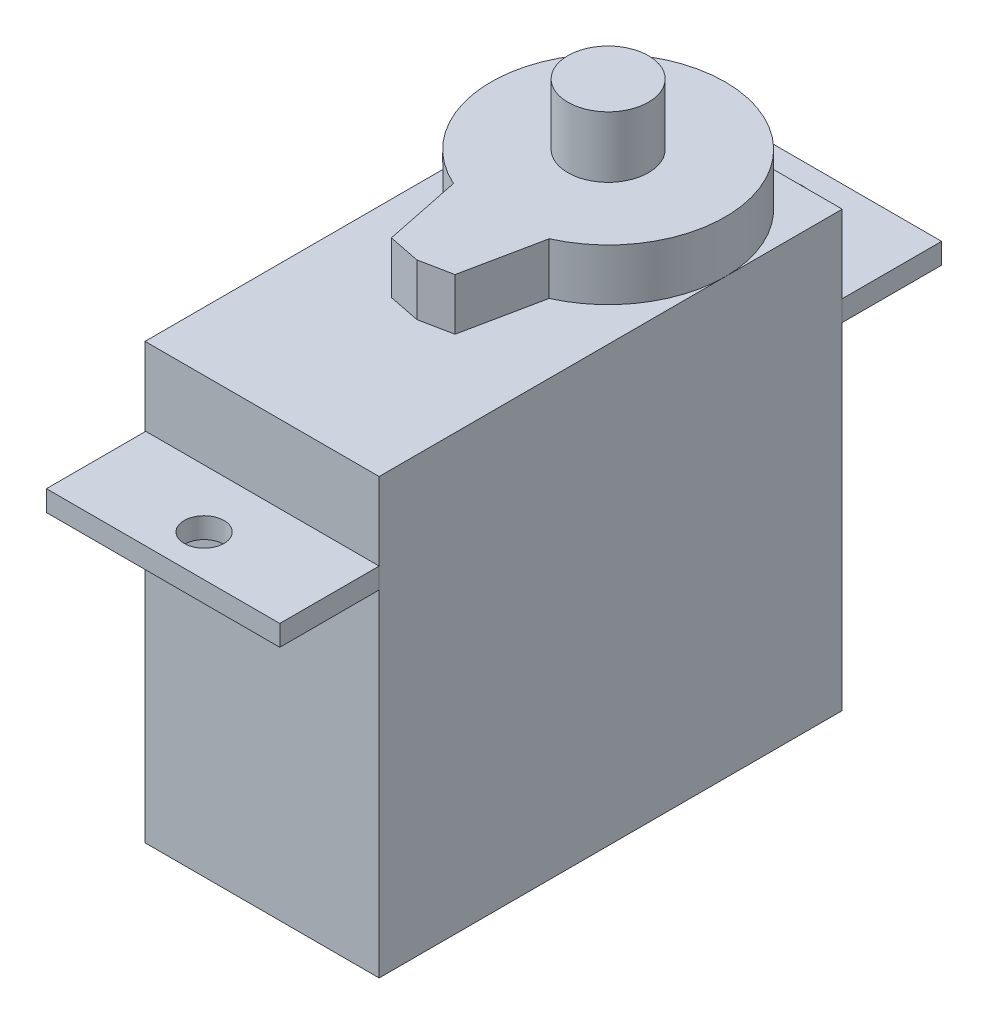
ISO-10303-21;
HEADER;
FILE_DESCRIPTION(('STEP AP214'),'2;1');
FILE_NAME('part.step','',(''),(''),'','','');
FILE_SCHEMA(('AUTOMOTIVE_DESIGN { 1 0 10303 214 1 1 1 1 }'));
ENDSEC;
DATA;
#1=APPLICATION_CONTEXT('core data for automotive mechanical design processes');
#2=APPLICATION_PROTOCOL_DEFINITION('international standard','automotive_design',2000,#1);
#3=PRODUCT_CONTEXT('',#1,'mechanical');
#4=PRODUCT('Part','Part','',(#3));
#5=PRODUCT_RELATED_PRODUCT_CATEGORY('part','',(#4));
#6=PRODUCT_DEFINITION_FORMATION('','',#4);
#7=PRODUCT_DEFINITION_CONTEXT('part definition',#1,'design');
#8=PRODUCT_DEFINITION('design','',#6,#7);
#9=PRODUCT_DEFINITION_SHAPE('','',#8);
#10=(LENGTH_UNIT() NAMED_UNIT(*) SI_UNIT(.MILLI.,.METRE.));
#11=(NAMED_UNIT(*) PLANE_ANGLE_UNIT() SI_UNIT($,.RADIAN.));
#12=(NAMED_UNIT(*) SI_UNIT($,.STERADIAN.) SOLID_ANGLE_UNIT());
#13=UNCERTAINTY_MEASURE_WITH_UNIT(LENGTH_MEASURE(1.E-05),#10,'distance_accuracy_value','');
#14=(GEOMETRIC_REPRESENTATION_CONTEXT(3) GLOBAL_UNCERTAINTY_ASSIGNED_CONTEXT((#13)) GLOBAL_UNIT_ASSIGNED_CONTEXT((#10,
#11,#12)) REPRESENTATION_CONTEXT('',''));
#15=CARTESIAN_POINT('',(0.,0.,0.));
#16=DIRECTION('',(0.,0.,1.));
#17=DIRECTION('',(1.,0.,0.));
#18=AXIS2_PLACEMENT_3D('',#15,#16,#17);
#19=CARTESIAN_POINT('',(-5.715,17.526,11.375));
#20=DIRECTION('',(0.,1.,0.));
#21=DIRECTION('',(0.,0.,1.));
#22=AXIS2_PLACEMENT_3D('',#19,#20,#21);
#23=PLANE('',#22);
#24=DIRECTION('',(-1.,0.,0.));
#25=VECTOR('',#24,1.);
#26=CARTESIAN_POINT('',(5.75,17.526,11.375));
#27=LINE('',#26,#25);
#28=CARTESIAN_POINT('',(5.75,17.526,11.375));
#29=VERTEX_POINT('',#28);
#30=CARTESIAN_POINT('',(-5.715,17.526,11.375));
#31=VERTEX_POINT('',#30);
#32=EDGE_CURVE('E190',#29,#31,#27,.T.);
#33=ORIENTED_EDGE('',*,*,#32,.T.);
#34=DIRECTION('',(0.,0.,1.));
#35=VECTOR('',#34,1.);
#36=CARTESIAN_POINT('',(-5.715,17.526,11.375));
#37=LINE('',#36,#35);
#38=CARTESIAN_POINT('',(-5.715,17.526,16.256));
#39=VERTEX_POINT('',#38);
#40=EDGE_CURVE('E185',#31,#39,#37,.T.);
#41=ORIENTED_EDGE('',*,*,#40,.T.);
#42=DIRECTION('',(1.,0.,0.));
#43=VECTOR('',#42,1.);
#44=CARTESIAN_POINT('',(5.75,17.526,16.256));
#45=LINE('',#44,#43);
#46=CARTESIAN_POINT('',(5.75,17.526,16.256));
#47=VERTEX_POINT('',#46);
#48=EDGE_CURVE('E188',#39,#47,#45,.T.);
#49=ORIENTED_EDGE('',*,*,#48,.T.);
#50=DIRECTION('',(0.,0.,-1.));
#51=VECTOR('',#50,1.);
#52=CARTESIAN_POINT('',(5.75,17.526,11.375));
#53=LINE('',#52,#51);
#54=EDGE_CURVE('E155',#47,#29,#53,.T.);
#55=ORIENTED_EDGE('',*,*,#54,.T.);
#56=EDGE_LOOP('',(#33,#41,#49,#55));
#57=FACE_BOUND('',#56,.T.);
#58=CARTESIAN_POINT('',(0.,17.526,14.224));
#59=DIRECTION('',(0.,1.,0.));
#60=DIRECTION('',(0.,0.,1.));
#61=AXIS2_PLACEMENT_3D('',#58,#59,#60);
#62=CIRCLE('',#61,0.9779);
#63=CARTESIAN_POINT('',(0.,17.526,15.2019));
#64=VERTEX_POINT('',#63);
#65=EDGE_CURVE('E205',#64,#64,#62,.T.);
#66=ORIENTED_EDGE('',*,*,#65,.F.);
#67=EDGE_LOOP('',(#66));
#68=FACE_BOUND('',#67,.T.);
#69=ADVANCED_FACE('F138',(#57,#68),#23,.T.);
#70=CARTESIAN_POINT('',(-5.715,16.51,11.375));
#71=DIRECTION('',(0.,1.,0.));
#72=DIRECTION('',(0.,0.,1.));
#73=AXIS2_PLACEMENT_3D('',#70,#71,#72);
#74=PLANE('',#73);
#75=DIRECTION('',(-1.,0.,0.));
#76=VECTOR('',#75,1.);
#77=CARTESIAN_POINT('',(5.75,16.51,11.375));
#78=LINE('',#77,#76);
#79=CARTESIAN_POINT('',(5.75,16.51,11.375));
#80=VERTEX_POINT('',#79);
#81=CARTESIAN_POINT('',(-5.715,16.51,11.375));
#82=VERTEX_POINT('',#81);
#83=EDGE_CURVE('E202',#80,#82,#78,.T.);
#84=ORIENTED_EDGE('',*,*,#83,.F.);
#85=DIRECTION('',(0.,0.,-1.));
#86=VECTOR('',#85,1.);
#87=CARTESIAN_POINT('',(5.75,16.51,11.375));
#88=LINE('',#87,#86);
#89=CARTESIAN_POINT('',(5.75,16.51,16.256));
#90=VERTEX_POINT('',#89);
#91=EDGE_CURVE('E178',#90,#80,#88,.T.);
#92=ORIENTED_EDGE('',*,*,#91,.F.);
#93=DIRECTION('',(1.,0.,0.));
#94=VECTOR('',#93,1.);
#95=CARTESIAN_POINT('',(5.75,16.51,16.256));
#96=LINE('',#95,#94);
#97=CARTESIAN_POINT('',(-5.715,16.51,16.256));
#98=VERTEX_POINT('',#97);
#99=EDGE_CURVE('E172',#98,#90,#96,.T.);
#100=ORIENTED_EDGE('',*,*,#99,.F.);
#101=DIRECTION('',(0.,0.,1.));
#102=VECTOR('',#101,1.);
#103=CARTESIAN_POINT('',(-5.715,16.51,11.375));
#104=LINE('',#103,#102);
#105=EDGE_CURVE('E194',#82,#98,#104,.T.);
#106=ORIENTED_EDGE('',*,*,#105,.F.);
#107=EDGE_LOOP('',(#84,#92,#100,#106));
#108=FACE_BOUND('',#107,.T.);
#109=CARTESIAN_POINT('',(0.,16.51,14.224));
#110=DIRECTION('',(0.,1.,0.));
#111=DIRECTION('',(0.,0.,1.));
#112=AXIS2_PLACEMENT_3D('',#109,#110,#111);
#113=CIRCLE('',#112,0.9779);
#114=CARTESIAN_POINT('',(0.,16.51,15.2019));
#115=VERTEX_POINT('',#114);
#116=EDGE_CURVE('E217',#115,#115,#113,.T.);
#117=ORIENTED_EDGE('',*,*,#116,.T.);
#118=EDGE_LOOP('',(#117));
#119=FACE_BOUND('',#118,.T.);
#120=ADVANCED_FACE('F213',(#108,#119),#74,.F.);
#121=CARTESIAN_POINT('',(5.75,17.526,11.375));
#122=DIRECTION('',(0.,0.,1.));
#123=DIRECTION('',(1.,0.,0.));
#124=AXIS2_PLACEMENT_3D('',#121,#122,#123);
#125=PLANE('',#124);
#126=ORIENTED_EDGE('',*,*,#83,.T.);
#127=DIRECTION('',(0.,-1.,0.));
#128=VECTOR('',#127,1.);
#129=CARTESIAN_POINT('',(-5.715,17.526,11.375));
#130=LINE('',#129,#128);
#131=EDGE_CURVE('E13',#31,#82,#130,.T.);
#132=ORIENTED_EDGE('',*,*,#131,.F.);
#133=ORIENTED_EDGE('',*,*,#32,.F.);
#134=DIRECTION('',(0.,-1.,0.));
#135=VECTOR('',#134,1.);
#136=CARTESIAN_POINT('',(5.75,17.526,11.375));
#137=LINE('',#136,#135);
#138=EDGE_CURVE('E198',#29,#80,#137,.T.);
#139=ORIENTED_EDGE('',*,*,#138,.T.);
#140=EDGE_LOOP('',(#126,#132,#133,#139));
#141=FACE_BOUND('',#140,.T.);
#142=ADVANCED_FACE('F140',(#141),#125,.F.);
#143=CARTESIAN_POINT('',(-5.715,17.526,11.375));
#144=DIRECTION('',(1.,0.,0.));
#145=DIRECTION('',(0.,0.,-1.));
#146=AXIS2_PLACEMENT_3D('',#143,#144,#145);
#147=PLANE('',#146);
#148=ORIENTED_EDGE('',*,*,#105,.T.);
#149=DIRECTION('',(0.,-1.,0.));
#150=VECTOR('',#149,1.);
#151=CARTESIAN_POINT('',(-5.715,17.526,16.256));
#152=LINE('',#151,#150);
#153=EDGE_CURVE('E147',#39,#98,#152,.T.);
#154=ORIENTED_EDGE('',*,*,#153,.F.);
#155=ORIENTED_EDGE('',*,*,#40,.F.);
#156=ORIENTED_EDGE('',*,*,#131,.T.);
#157=EDGE_LOOP('',(#148,#154,#155,#156));
#158=FACE_BOUND('',#157,.T.);
#159=ADVANCED_FACE('F193',(#158),#147,.F.);
#160=CARTESIAN_POINT('',(5.75,17.526,16.256));
#161=DIRECTION('',(0.,0.,-1.));
#162=DIRECTION('',(-1.,0.,0.));
#163=AXIS2_PLACEMENT_3D('',#160,#161,#162);
#164=PLANE('',#163);
#165=ORIENTED_EDGE('',*,*,#99,.T.);
#166=DIRECTION('',(0.,-1.,0.));
#167=VECTOR('',#166,1.);
#168=CARTESIAN_POINT('',(5.75,17.526,16.256));
#169=LINE('',#168,#167);
#170=EDGE_CURVE('E195',#47,#90,#169,.T.);
#171=ORIENTED_EDGE('',*,*,#170,.F.);
#172=ORIENTED_EDGE('',*,*,#48,.F.);
#173=ORIENTED_EDGE('',*,*,#153,.T.);
#174=EDGE_LOOP('',(#165,#171,#172,#173));
#175=FACE_BOUND('',#174,.T.);
#176=ADVANCED_FACE('F196',(#175),#164,.F.);
#177=CARTESIAN_POINT('',(5.75,17.526,11.375));
#178=DIRECTION('',(-1.,0.,0.));
#179=DIRECTION('',(0.,0.,1.));
#180=AXIS2_PLACEMENT_3D('',#177,#178,#179);
#181=PLANE('',#180);
#182=ORIENTED_EDGE('',*,*,#91,.T.);
#183=ORIENTED_EDGE('',*,*,#138,.F.);
#184=ORIENTED_EDGE('',*,*,#54,.F.);
#185=ORIENTED_EDGE('',*,*,#170,.T.);
#186=EDGE_LOOP('',(#182,#183,#184,#185));
#187=FACE_BOUND('',#186,.T.);
#188=ADVANCED_FACE('F210',(#187),#181,.F.);
#189=CARTESIAN_POINT('',(0.,17.526,14.224));
#190=DIRECTION('',(0.,-1.,0.));
#191=DIRECTION('',(0.,0.,-1.));
#192=AXIS2_PLACEMENT_3D('',#189,#190,#191);
#193=CYLINDRICAL_SURFACE('',#192,0.9779);
#194=ORIENTED_EDGE('',*,*,#65,.T.);
#195=EDGE_LOOP('',(#194));
#196=FACE_BOUND('',#195,.T.);
#197=ORIENTED_EDGE('',*,*,#116,.F.);
#198=EDGE_LOOP('',(#197));
#199=FACE_BOUND('',#198,.T.);
#200=ADVANCED_FACE('F223',(#196,#199),#193,.F.);
#201=CLOSED_SHELL('',(#69,#120,#142,#159,#176,#188,#200));
#202=MANIFOLD_SOLID_BREP('B2',#201);
#203=CARTESIAN_POINT('',(5.75,17.526,-16.256));
#204=DIRECTION('',(0.,1.,0.));
#205=DIRECTION('',(0.,0.,1.));
#206=AXIS2_PLACEMENT_3D('',#203,#204,#205);
#207=PLANE('',#206);
#208=DIRECTION('',(0.,0.,-1.));
#209=VECTOR('',#208,1.);
#210=CARTESIAN_POINT('',(5.75,17.526,-11.375));
#211=LINE('',#210,#209);
#212=CARTESIAN_POINT('',(5.75,17.526,-11.375));
#213=VERTEX_POINT('',#212);
#214=CARTESIAN_POINT('',(5.75,17.526,-16.256));
#215=VERTEX_POINT('',#214);
#216=EDGE_CURVE('E348',#213,#215,#211,.T.);
#217=ORIENTED_EDGE('',*,*,#216,.T.);
#218=DIRECTION('',(-1.,0.,0.));
#219=VECTOR('',#218,1.);
#220=CARTESIAN_POINT('',(5.75,17.526,-16.256));
#221=LINE('',#220,#219);
#222=CARTESIAN_POINT('',(-5.715,17.526,-16.256));
#223=VERTEX_POINT('',#222);
#224=EDGE_CURVE('E343',#215,#223,#221,.T.);
#225=ORIENTED_EDGE('',*,*,#224,.T.);
#226=DIRECTION('',(0.,0.,1.));
#227=VECTOR('',#226,1.);
#228=CARTESIAN_POINT('',(-5.715,17.526,-11.375));
#229=LINE('',#228,#227);
#230=CARTESIAN_POINT('',(-5.715,17.526,-11.375));
#231=VERTEX_POINT('',#230);
#232=EDGE_CURVE('E346',#223,#231,#229,.T.);
#233=ORIENTED_EDGE('',*,*,#232,.T.);
#234=DIRECTION('',(1.,0.,0.));
#235=VECTOR('',#234,1.);
#236=CARTESIAN_POINT('',(5.75,17.526,-11.375));
#237=LINE('',#236,#235);
#238=EDGE_CURVE('E313',#231,#213,#237,.T.);
#239=ORIENTED_EDGE('',*,*,#238,.T.);
#240=EDGE_LOOP('',(#217,#225,#233,#239));
#241=FACE_BOUND('',#240,.T.);
#242=CARTESIAN_POINT('',(0.,17.526,-14.224));
#243=DIRECTION('',(0.,1.,0.));
#244=DIRECTION('',(0.,0.,1.));
#245=AXIS2_PLACEMENT_3D('',#242,#243,#244);
#246=CIRCLE('',#245,0.9779);
#247=CARTESIAN_POINT('',(0.,17.526,-13.2461));
#248=VERTEX_POINT('',#247);
#249=EDGE_CURVE('E363',#248,#248,#246,.T.);
#250=ORIENTED_EDGE('',*,*,#249,.F.);
#251=EDGE_LOOP('',(#250));
#252=FACE_BOUND('',#251,.T.);
#253=ADVANCED_FACE('F296',(#241,#252),#207,.T.);
#254=CARTESIAN_POINT('',(5.75,16.51,-16.256));
#255=DIRECTION('',(0.,1.,0.));
#256=DIRECTION('',(0.,0.,1.));
#257=AXIS2_PLACEMENT_3D('',#254,#255,#256);
#258=PLANE('',#257);
#259=DIRECTION('',(0.,0.,-1.));
#260=VECTOR('',#259,1.);
#261=CARTESIAN_POINT('',(5.75,16.51,-11.375));
#262=LINE('',#261,#260);
#263=CARTESIAN_POINT('',(5.75,16.51,-11.375));
#264=VERTEX_POINT('',#263);
#265=CARTESIAN_POINT('',(5.75,16.51,-16.256));
#266=VERTEX_POINT('',#265);
#267=EDGE_CURVE('E360',#264,#266,#262,.T.);
#268=ORIENTED_EDGE('',*,*,#267,.F.);
#269=DIRECTION('',(1.,0.,0.));
#270=VECTOR('',#269,1.);
#271=CARTESIAN_POINT('',(5.75,16.51,-11.375));
#272=LINE('',#271,#270);
#273=CARTESIAN_POINT('',(-5.715,16.51,-11.375));
#274=VERTEX_POINT('',#273);
#275=EDGE_CURVE('E336',#274,#264,#272,.T.);
#276=ORIENTED_EDGE('',*,*,#275,.F.);
#277=DIRECTION('',(0.,0.,1.));
#278=VECTOR('',#277,1.);
#279=CARTESIAN_POINT('',(-5.715,16.51,-11.375));
#280=LINE('',#279,#278);
#281=CARTESIAN_POINT('',(-5.715,16.51,-16.256));
#282=VERTEX_POINT('',#281);
#283=EDGE_CURVE('E330',#282,#274,#280,.T.);
#284=ORIENTED_EDGE('',*,*,#283,.F.);
#285=DIRECTION('',(-1.,0.,0.));
#286=VECTOR('',#285,1.);
#287=CARTESIAN_POINT('',(5.75,16.51,-16.256));
#288=LINE('',#287,#286);
#289=EDGE_CURVE('E352',#266,#282,#288,.T.);
#290=ORIENTED_EDGE('',*,*,#289,.F.);
#291=EDGE_LOOP('',(#268,#276,#284,#290));
#292=FACE_BOUND('',#291,.T.);
#293=CARTESIAN_POINT('',(0.,16.51,-14.224));
#294=DIRECTION('',(0.,1.,0.));
#295=DIRECTION('',(0.,0.,1.));
#296=AXIS2_PLACEMENT_3D('',#293,#294,#295);
#297=CIRCLE('',#296,0.9779);
#298=CARTESIAN_POINT('',(0.,16.51,-13.2461));
#299=VERTEX_POINT('',#298);
#300=EDGE_CURVE('E375',#299,#299,#297,.T.);
#301=ORIENTED_EDGE('',*,*,#300,.T.);
#302=EDGE_LOOP('',(#301));
#303=FACE_BOUND('',#302,.T.);
#304=ADVANCED_FACE('F371',(#292,#303),#258,.F.);
#305=CARTESIAN_POINT('',(5.75,17.526,-11.375));
#306=DIRECTION('',(-1.,0.,0.));
#307=DIRECTION('',(0.,0.,1.));
#308=AXIS2_PLACEMENT_3D('',#305,#306,#307);
#309=PLANE('',#308);
#310=ORIENTED_EDGE('',*,*,#267,.T.);
#311=DIRECTION('',(0.,-1.,0.));
#312=VECTOR('',#311,1.);
#313=CARTESIAN_POINT('',(5.75,17.526,-16.256));
#314=LINE('',#313,#312);
#315=EDGE_CURVE('E136',#215,#266,#314,.T.);
#316=ORIENTED_EDGE('',*,*,#315,.F.);
#317=ORIENTED_EDGE('',*,*,#216,.F.);
#318=DIRECTION('',(0.,-1.,0.));
#319=VECTOR('',#318,1.);
#320=CARTESIAN_POINT('',(5.75,17.526,-11.375));
#321=LINE('',#320,#319);
#322=EDGE_CURVE('E356',#213,#264,#321,.T.);
#323=ORIENTED_EDGE('',*,*,#322,.T.);
#324=EDGE_LOOP('',(#310,#316,#317,#323));
#325=FACE_BOUND('',#324,.T.);
#326=ADVANCED_FACE('F298',(#325),#309,.F.);
#327=CARTESIAN_POINT('',(5.75,17.526,-16.256));
#328=DIRECTION('',(0.,0.,1.));
#329=DIRECTION('',(1.,0.,0.));
#330=AXIS2_PLACEMENT_3D('',#327,#328,#329);
#331=PLANE('',#330);
#332=ORIENTED_EDGE('',*,*,#289,.T.);
#333=DIRECTION('',(0.,-1.,0.));
#334=VECTOR('',#333,1.);
#335=CARTESIAN_POINT('',(-5.715,17.526,-16.256));
#336=LINE('',#335,#334);
#337=EDGE_CURVE('E305',#223,#282,#336,.T.);
#338=ORIENTED_EDGE('',*,*,#337,.F.);
#339=ORIENTED_EDGE('',*,*,#224,.F.);
#340=ORIENTED_EDGE('',*,*,#315,.T.);
#341=EDGE_LOOP('',(#332,#338,#339,#340));
#342=FACE_BOUND('',#341,.T.);
#343=ADVANCED_FACE('F351',(#342),#331,.F.);
#344=CARTESIAN_POINT('',(-5.715,17.526,-11.375));
#345=DIRECTION('',(1.,0.,0.));
#346=DIRECTION('',(0.,0.,-1.));
#347=AXIS2_PLACEMENT_3D('',#344,#345,#346);
#348=PLANE('',#347);
#349=ORIENTED_EDGE('',*,*,#283,.T.);
#350=DIRECTION('',(0.,-1.,0.));
#351=VECTOR('',#350,1.);
#352=CARTESIAN_POINT('',(-5.715,17.526,-11.375));
#353=LINE('',#352,#351);
#354=EDGE_CURVE('E353',#231,#274,#353,.T.);
#355=ORIENTED_EDGE('',*,*,#354,.F.);
#356=ORIENTED_EDGE('',*,*,#232,.F.);
#357=ORIENTED_EDGE('',*,*,#337,.T.);
#358=EDGE_LOOP('',(#349,#355,#356,#357));
#359=FACE_BOUND('',#358,.T.);
#360=ADVANCED_FACE('F354',(#359),#348,.F.);
#361=CARTESIAN_POINT('',(5.75,17.526,-11.375));
#362=DIRECTION('',(0.,0.,-1.));
#363=DIRECTION('',(-1.,0.,0.));
#364=AXIS2_PLACEMENT_3D('',#361,#362,#363);
#365=PLANE('',#364);
#366=ORIENTED_EDGE('',*,*,#275,.T.);
#367=ORIENTED_EDGE('',*,*,#322,.F.);
#368=ORIENTED_EDGE('',*,*,#238,.F.);
#369=ORIENTED_EDGE('',*,*,#354,.T.);
#370=EDGE_LOOP('',(#366,#367,#368,#369));
#371=FACE_BOUND('',#370,.T.);
#372=ADVANCED_FACE('F368',(#371),#365,.F.);
#373=CARTESIAN_POINT('',(0.,17.526,-14.224));
#374=DIRECTION('',(0.,-1.,0.));
#375=DIRECTION('',(0.,0.,-1.));
#376=AXIS2_PLACEMENT_3D('',#373,#374,#375);
#377=CYLINDRICAL_SURFACE('',#376,0.9779);
#378=ORIENTED_EDGE('',*,*,#249,.T.);
#379=EDGE_LOOP('',(#378));
#380=FACE_BOUND('',#379,.T.);
#381=ORIENTED_EDGE('',*,*,#300,.F.);
#382=EDGE_LOOP('',(#381));
#383=FACE_BOUND('',#382,.T.);
#384=ADVANCED_FACE('F381',(#380,#383),#377,.F.);
#385=CLOSED_SHELL('',(#253,#304,#326,#343,#360,#372,#384));
#386=MANIFOLD_SOLID_BREP('B7',#385);
#387=CARTESIAN_POINT('',(-5.75,23.876,-11.375));
#388=DIRECTION('',(0.,1.,0.));
#389=DIRECTION('',(0.,0.,1.));
#390=AXIS2_PLACEMENT_3D('',#387,#388,#389);
#391=PLANE('',#390);
#392=CARTESIAN_POINT('',(0.,23.876,-5.625));
#393=DIRECTION('',(0.,1.,0.));
#394=DIRECTION('',(0.,0.,1.));
#395=AXIS2_PLACEMENT_3D('',#392,#393,#394);
#396=CIRCLE('',#395,5.75);
#397=CARTESIAN_POINT('',(2.35114704859858,23.876,-0.377657095646777));
#398=VERTEX_POINT('',#397);
#399=CARTESIAN_POINT('',(-2.35114704859859,23.876,-0.377657095646777));
#400=VERTEX_POINT('',#399);
#401=EDGE_CURVE('E460',#398,#400,#396,.T.);
#402=ORIENTED_EDGE('',*,*,#401,.T.);
#403=DIRECTION('',(0.201292370135367,0.,0.979531205079903));
#404=VECTOR('',#403,1.);
#405=CARTESIAN_POINT('',(-2.18141835433677,23.876,0.448278593396543));
#406=LINE('',#405,#404);
#407=CARTESIAN_POINT('',(-1.56253455282385,23.876,3.45989793839557));
#408=VERTEX_POINT('',#407);
#409=EDGE_CURVE('E551',#400,#408,#406,.T.);
#410=ORIENTED_EDGE('',*,*,#409,.T.);
#411=DIRECTION('',(0.98058067569092,0.,0.196116135138186));
#412=VECTOR('',#411,1.);
#413=CARTESIAN_POINT('',(-0.725462470953917,23.876,3.62731235476955));
#414=LINE('',#413,#412);
#415=CARTESIAN_POINT('',(0.,23.876,3.77240484896034));
#416=VERTEX_POINT('',#415);
#417=EDGE_CURVE('E563',#408,#416,#414,.T.);
#418=ORIENTED_EDGE('',*,*,#417,.T.);
#419=DIRECTION('',(-0.98058067569092,0.,0.196116135138184));
#420=VECTOR('',#419,1.);
#421=CARTESIAN_POINT('',(0.725462470953913,23.876,3.62731235476956));
#422=LINE('',#421,#420);
#423=CARTESIAN_POINT('',(1.56253455282385,23.876,3.45989793839557));
#424=VERTEX_POINT('',#423);
#425=EDGE_CURVE('E585',#424,#416,#422,.T.);
#426=ORIENTED_EDGE('',*,*,#425,.F.);
#427=DIRECTION('',(-0.201292370135367,0.,0.979531205079903));
#428=VECTOR('',#427,1.);
#429=CARTESIAN_POINT('',(2.18141835433677,23.876,0.448278593396543));
#430=LINE('',#429,#428);
#431=EDGE_CURVE('E582',#398,#424,#430,.T.);
#432=ORIENTED_EDGE('',*,*,#431,.F.);
#433=EDGE_LOOP('',(#402,#410,#418,#426,#432));
#434=FACE_BOUND('',#433,.T.);
#435=CARTESIAN_POINT('',(0.,23.876,-5.625));
#436=DIRECTION('',(0.,1.,0.));
#437=DIRECTION('',(0.,0.,1.));
#438=AXIS2_PLACEMENT_3D('',#435,#436,#437);
#439=CIRCLE('',#438,1.9812);
#440=CARTESIAN_POINT('',(0.,23.876,-3.6438));
#441=VERTEX_POINT('',#440);
#442=EDGE_CURVE('E761',#441,#441,#439,.T.);
#443=ORIENTED_EDGE('',*,*,#442,.F.);
#444=EDGE_LOOP('',(#443));
#445=FACE_BOUND('',#444,.T.);
#446=ADVANCED_FACE('F445',(#434,#445),#391,.T.);
#447=CARTESIAN_POINT('',(5.75,23.876,-11.375));
#448=DIRECTION('',(0.,0.,1.));
#449=DIRECTION('',(1.,0.,0.));
#450=AXIS2_PLACEMENT_3D('',#447,#448,#449);
#451=PLANE('',#450);
#452=DIRECTION('',(-1.,0.,0.));
#453=VECTOR('',#452,1.);
#454=CARTESIAN_POINT('',(0.,21.336,-11.375));
#455=LINE('',#454,#453);
#456=CARTESIAN_POINT('',(0.,21.336,-11.375));
#457=VERTEX_POINT('',#456);
#458=CARTESIAN_POINT('',(-5.75,21.336,-11.375));
#459=VERTEX_POINT('',#458);
#460=EDGE_CURVE('E530',#457,#459,#455,.T.);
#461=ORIENTED_EDGE('',*,*,#460,.F.);
#462=DIRECTION('',(-1.,0.,0.));
#463=VECTOR('',#462,1.);
#464=CARTESIAN_POINT('',(0.,21.336,-11.375));
#465=LINE('',#464,#463);
#466=CARTESIAN_POINT('',(5.75,21.336,-11.375));
#467=VERTEX_POINT('',#466);
#468=EDGE_CURVE('E535',#467,#457,#465,.T.);
#469=ORIENTED_EDGE('',*,*,#468,.F.);
#470=DIRECTION('',(0.,-1.,0.));
#471=VECTOR('',#470,1.);
#472=CARTESIAN_POINT('',(5.75,23.876,-11.375));
#473=LINE('',#472,#471);
#474=CARTESIAN_POINT('',(5.75,0.,-11.375));
#475=VERTEX_POINT('',#474);
#476=EDGE_CURVE('E612',#467,#475,#473,.T.);
#477=ORIENTED_EDGE('',*,*,#476,.T.);
#478=DIRECTION('',(-1.,0.,0.));
#479=VECTOR('',#478,1.);
#480=CARTESIAN_POINT('',(5.75,0.,-11.375));
#481=LINE('',#480,#479);
#482=CARTESIAN_POINT('',(-5.75,0.,-11.375));
#483=VERTEX_POINT('',#482);
#484=EDGE_CURVE('E609',#475,#483,#481,.T.);
#485=ORIENTED_EDGE('',*,*,#484,.T.);
#486=DIRECTION('',(0.,-1.,0.));
#487=VECTOR('',#486,1.);
#488=CARTESIAN_POINT('',(-5.75,23.876,-11.375));
#489=LINE('',#488,#487);
#490=EDGE_CURVE('E468',#459,#483,#489,.T.);
#491=ORIENTED_EDGE('',*,*,#490,.F.);
#492=EDGE_LOOP('',(#461,#469,#477,#485,#491));
#493=FACE_BOUND('',#492,.T.);
#494=ADVANCED_FACE('F539',(#493),#451,.F.);
#495=CARTESIAN_POINT('',(-5.75,23.876,11.375));
#496=DIRECTION('',(1.,0.,0.));
#497=DIRECTION('',(0.,0.,-1.));
#498=AXIS2_PLACEMENT_3D('',#495,#496,#497);
#499=PLANE('',#498);
#500=DIRECTION('',(0.,0.,1.));
#501=VECTOR('',#500,1.);
#502=CARTESIAN_POINT('',(-5.75,21.336,0.));
#503=LINE('',#502,#501);
#504=CARTESIAN_POINT('',(-5.75,21.336,-5.625));
#505=VERTEX_POINT('',#504);
#506=EDGE_CURVE('E531',#459,#505,#503,.T.);
#507=ORIENTED_EDGE('',*,*,#506,.F.);
#508=ORIENTED_EDGE('',*,*,#490,.T.);
#509=DIRECTION('',(0.,0.,1.));
#510=VECTOR('',#509,1.);
#511=CARTESIAN_POINT('',(-5.75,0.,11.375));
#512=LINE('',#511,#510);
#513=CARTESIAN_POINT('',(-5.75,0.,11.375));
#514=VERTEX_POINT('',#513);
#515=EDGE_CURVE('E593',#483,#514,#512,.T.);
#516=ORIENTED_EDGE('',*,*,#515,.T.);
#517=DIRECTION('',(0.,-1.,0.));
#518=VECTOR('',#517,1.);
#519=CARTESIAN_POINT('',(-5.75,23.876,11.375));
#520=LINE('',#519,#518);
#521=CARTESIAN_POINT('',(-5.75,21.336,11.375));
#522=VERTEX_POINT('',#521);
#523=EDGE_CURVE('E294',#522,#514,#520,.T.);
#524=ORIENTED_EDGE('',*,*,#523,.F.);
#525=DIRECTION('',(0.,0.,1.));
#526=VECTOR('',#525,1.);
#527=CARTESIAN_POINT('',(-5.75,21.336,0.));
#528=LINE('',#527,#526);
#529=EDGE_CURVE('E565',#505,#522,#528,.T.);
#530=ORIENTED_EDGE('',*,*,#529,.F.);
#531=EDGE_LOOP('',(#507,#508,#516,#524,#530));
#532=FACE_BOUND('',#531,.T.);
#533=ADVANCED_FACE('F447',(#532),#499,.F.);
#534=CARTESIAN_POINT('',(5.75,23.876,11.375));
#535=DIRECTION('',(-1.,0.,0.));
#536=DIRECTION('',(0.,0.,1.));
#537=AXIS2_PLACEMENT_3D('',#534,#535,#536);
#538=PLANE('',#537);
#539=DIRECTION('',(0.,0.,-1.));
#540=VECTOR('',#539,1.);
#541=CARTESIAN_POINT('',(5.75,21.336,0.));
#542=LINE('',#541,#540);
#543=CARTESIAN_POINT('',(5.75,21.336,-5.625));
#544=VERTEX_POINT('',#543);
#545=EDGE_CURVE('E552',#544,#467,#542,.T.);
#546=ORIENTED_EDGE('',*,*,#545,.F.);
#547=DIRECTION('',(0.,0.,-1.));
#548=VECTOR('',#547,1.);
#549=CARTESIAN_POINT('',(5.75,21.336,0.));
#550=LINE('',#549,#548);
#551=CARTESIAN_POINT('',(5.75,21.336,11.375));
#552=VERTEX_POINT('',#551);
#553=EDGE_CURVE('E569',#552,#544,#550,.T.);
#554=ORIENTED_EDGE('',*,*,#553,.F.);
#555=DIRECTION('',(0.,-1.,0.));
#556=VECTOR('',#555,1.);
#557=CARTESIAN_POINT('',(5.75,23.876,11.375));
#558=LINE('',#557,#556);
#559=CARTESIAN_POINT('',(5.75,0.,11.375));
#560=VERTEX_POINT('',#559);
#561=EDGE_CURVE('E453',#552,#560,#558,.T.);
#562=ORIENTED_EDGE('',*,*,#561,.T.);
#563=DIRECTION('',(0.,0.,-1.));
#564=VECTOR('',#563,1.);
#565=CARTESIAN_POINT('',(5.75,0.,11.375));
#566=LINE('',#565,#564);
#567=EDGE_CURVE('E606',#560,#475,#566,.T.);
#568=ORIENTED_EDGE('',*,*,#567,.T.);
#569=ORIENTED_EDGE('',*,*,#476,.F.);
#570=EDGE_LOOP('',(#546,#554,#562,#568,#569));
#571=FACE_BOUND('',#570,.T.);
#572=ADVANCED_FACE('F616',(#571),#538,.F.);
#573=CARTESIAN_POINT('',(5.75,23.876,11.375));
#574=DIRECTION('',(0.,0.,-1.));
#575=DIRECTION('',(-1.,0.,0.));
#576=AXIS2_PLACEMENT_3D('',#573,#574,#575);
#577=PLANE('',#576);
#578=DIRECTION('',(1.,0.,0.));
#579=VECTOR('',#578,1.);
#580=CARTESIAN_POINT('',(0.,21.336,11.375));
#581=LINE('',#580,#579);
#582=EDGE_CURVE('E567',#522,#552,#581,.T.);
#583=ORIENTED_EDGE('',*,*,#582,.F.);
#584=ORIENTED_EDGE('',*,*,#523,.T.);
#585=DIRECTION('',(1.,0.,0.));
#586=VECTOR('',#585,1.);
#587=CARTESIAN_POINT('',(5.75,0.,11.375));
#588=LINE('',#587,#586);
#589=EDGE_CURVE('E603',#514,#560,#588,.T.);
#590=ORIENTED_EDGE('',*,*,#589,.T.);
#591=ORIENTED_EDGE('',*,*,#561,.F.);
#592=EDGE_LOOP('',(#583,#584,#590,#591));
#593=FACE_BOUND('',#592,.T.);
#594=ADVANCED_FACE('F622',(#593),#577,.F.);
#595=CARTESIAN_POINT('',(-5.75,0.,-11.375));
#596=DIRECTION('',(0.,1.,0.));
#597=DIRECTION('',(0.,0.,1.));
#598=AXIS2_PLACEMENT_3D('',#595,#596,#597);
#599=PLANE('',#598);
#600=ORIENTED_EDGE('',*,*,#515,.F.);
#601=ORIENTED_EDGE('',*,*,#484,.F.);
#602=ORIENTED_EDGE('',*,*,#567,.F.);
#603=ORIENTED_EDGE('',*,*,#589,.F.);
#604=EDGE_LOOP('',(#600,#601,#602,#603));
#605=FACE_BOUND('',#604,.T.);
#606=ADVANCED_FACE('F626',(#605),#599,.F.);
#607=CARTESIAN_POINT('',(-2.18141835433677,21.336,0.448278593396543));
#608=DIRECTION('',(-0.979531205079903,0.,0.201292370135367));
#609=DIRECTION('',(0.201292370135367,0.,0.979531205079903));
#610=AXIS2_PLACEMENT_3D('',#607,#608,#609);
#611=PLANE('',#610);
#612=ORIENTED_EDGE('',*,*,#409,.F.);
#613=DIRECTION('',(0.,1.,0.));
#614=VECTOR('',#613,1.);
#615=CARTESIAN_POINT('',(-2.35114704859859,21.336,-0.377657095646777));
#616=LINE('',#615,#614);
#617=CARTESIAN_POINT('',(-2.35114704859859,21.336,-0.377657095646777));
#618=VERTEX_POINT('',#617);
#619=EDGE_CURVE('E579',#618,#400,#616,.T.);
#620=ORIENTED_EDGE('',*,*,#619,.F.);
#621=DIRECTION('',(0.201292370135367,0.,0.979531205079903));
#622=VECTOR('',#621,1.);
#623=CARTESIAN_POINT('',(-2.18141835433677,21.336,0.448278593396543));
#624=LINE('',#623,#622);
#625=CARTESIAN_POINT('',(-1.56253455282385,21.336,3.45989793839557));
#626=VERTEX_POINT('',#625);
#627=EDGE_CURVE('E559',#618,#626,#624,.T.);
#628=ORIENTED_EDGE('',*,*,#627,.T.);
#629=DIRECTION('',(0.,1.,0.));
#630=VECTOR('',#629,1.);
#631=CARTESIAN_POINT('',(-1.56253455282385,21.336,3.45989793839557));
#632=LINE('',#631,#630);
#633=EDGE_CURVE('E590',#626,#408,#632,.T.);
#634=ORIENTED_EDGE('',*,*,#633,.T.);
#635=EDGE_LOOP('',(#612,#620,#628,#634));
#636=FACE_BOUND('',#635,.T.);
#637=ADVANCED_FACE('F633',(#636),#611,.T.);
#638=CARTESIAN_POINT('',(-0.725462470953917,21.336,3.62731235476955));
#639=DIRECTION('',(-0.196116135138186,0.,0.98058067569092));
#640=DIRECTION('',(0.98058067569092,0.,0.196116135138186));
#641=AXIS2_PLACEMENT_3D('',#638,#639,#640);
#642=PLANE('',#641);
#643=ORIENTED_EDGE('',*,*,#417,.F.);
#644=ORIENTED_EDGE('',*,*,#633,.F.);
#645=DIRECTION('',(0.98058067569092,0.,0.196116135138186));
#646=VECTOR('',#645,1.);
#647=CARTESIAN_POINT('',(-0.725462470953917,21.336,3.62731235476955));
#648=LINE('',#647,#646);
#649=CARTESIAN_POINT('',(0.,21.336,3.77240484896034));
#650=VERTEX_POINT('',#649);
#651=EDGE_CURVE('E577',#626,#650,#648,.T.);
#652=ORIENTED_EDGE('',*,*,#651,.T.);
#653=DIRECTION('',(0.,1.,0.));
#654=VECTOR('',#653,1.);
#655=CARTESIAN_POINT('',(0.,21.336,3.77240484896034));
#656=LINE('',#655,#654);
#657=EDGE_CURVE('E594',#650,#416,#656,.T.);
#658=ORIENTED_EDGE('',*,*,#657,.T.);
#659=EDGE_LOOP('',(#643,#644,#652,#658));
#660=FACE_BOUND('',#659,.T.);
#661=ADVANCED_FACE('F638',(#660),#642,.T.);
#662=CARTESIAN_POINT('',(0.725462470953913,21.336,3.62731235476956));
#663=DIRECTION('',(-0.196116135138184,0.,-0.98058067569092));
#664=DIRECTION('',(-0.98058067569092,0.,0.196116135138184));
#665=AXIS2_PLACEMENT_3D('',#662,#663,#664);
#666=PLANE('',#665);
#667=ORIENTED_EDGE('',*,*,#425,.T.);
#668=ORIENTED_EDGE('',*,*,#657,.F.);
#669=DIRECTION('',(-0.98058067569092,0.,0.196116135138184));
#670=VECTOR('',#669,1.);
#671=CARTESIAN_POINT('',(0.725462470953913,21.336,3.62731235476956));
#672=LINE('',#671,#670);
#673=CARTESIAN_POINT('',(1.56253455282385,21.336,3.45989793839557));
#674=VERTEX_POINT('',#673);
#675=EDGE_CURVE('E574',#674,#650,#672,.T.);
#676=ORIENTED_EDGE('',*,*,#675,.F.);
#677=DIRECTION('',(0.,1.,0.));
#678=VECTOR('',#677,1.);
#679=CARTESIAN_POINT('',(1.56253455282385,21.336,3.45989793839557));
#680=LINE('',#679,#678);
#681=EDGE_CURVE('E596',#674,#424,#680,.T.);
#682=ORIENTED_EDGE('',*,*,#681,.T.);
#683=EDGE_LOOP('',(#667,#668,#676,#682));
#684=FACE_BOUND('',#683,.T.);
#685=ADVANCED_FACE('F642',(#684),#666,.F.);
#686=CARTESIAN_POINT('',(2.18141835433677,21.336,0.448278593396543));
#687=DIRECTION('',(-0.979531205079903,0.,-0.201292370135367));
#688=DIRECTION('',(-0.201292370135367,0.,0.979531205079903));
#689=AXIS2_PLACEMENT_3D('',#686,#687,#688);
#690=PLANE('',#689);
#691=ORIENTED_EDGE('',*,*,#431,.T.);
#692=ORIENTED_EDGE('',*,*,#681,.F.);
#693=DIRECTION('',(-0.201292370135367,0.,0.979531205079903));
#694=VECTOR('',#693,1.);
#695=CARTESIAN_POINT('',(2.18141835433677,21.336,0.448278593396543));
#696=LINE('',#695,#694);
#697=CARTESIAN_POINT('',(2.35114704859858,21.336,-0.377657095646777));
#698=VERTEX_POINT('',#697);
#699=EDGE_CURVE('E571',#698,#674,#696,.T.);
#700=ORIENTED_EDGE('',*,*,#699,.F.);
#701=DIRECTION('',(0.,1.,0.));
#702=VECTOR('',#701,1.);
#703=CARTESIAN_POINT('',(2.35114704859858,21.336,-0.377657095646777));
#704=LINE('',#703,#702);
#705=EDGE_CURVE('E598',#698,#398,#704,.T.);
#706=ORIENTED_EDGE('',*,*,#705,.T.);
#707=EDGE_LOOP('',(#691,#692,#700,#706));
#708=FACE_BOUND('',#707,.T.);
#709=ADVANCED_FACE('F645',(#708),#690,.F.);
#710=CARTESIAN_POINT('',(0.,21.336,-5.625));
#711=DIRECTION('',(0.,1.,0.));
#712=DIRECTION('',(0.,0.,1.));
#713=AXIS2_PLACEMENT_3D('',#710,#711,#712);
#714=CYLINDRICAL_SURFACE('',#713,5.75);
#715=ORIENTED_EDGE('',*,*,#401,.F.);
#716=ORIENTED_EDGE('',*,*,#705,.F.);
#717=CARTESIAN_POINT('',(0.,21.336,-5.625));
#718=DIRECTION('',(0.,1.,0.));
#719=DIRECTION('',(0.,0.,1.));
#720=AXIS2_PLACEMENT_3D('',#717,#718,#719);
#721=CIRCLE('',#720,5.75);
#722=EDGE_CURVE('E547',#698,#544,#721,.T.);
#723=ORIENTED_EDGE('',*,*,#722,.T.);
#724=CARTESIAN_POINT('',(0.,21.336,-5.625));
#725=DIRECTION('',(0.,1.,0.));
#726=DIRECTION('',(0.,0.,1.));
#727=AXIS2_PLACEMENT_3D('',#724,#725,#726);
#728=CIRCLE('',#727,5.75);
#729=EDGE_CURVE('E544',#544,#457,#728,.T.);
#730=ORIENTED_EDGE('',*,*,#729,.T.);
#731=CARTESIAN_POINT('',(0.,21.336,-5.625));
#732=DIRECTION('',(0.,1.,0.));
#733=DIRECTION('',(0.,0.,1.));
#734=AXIS2_PLACEMENT_3D('',#731,#732,#733);
#735=CIRCLE('',#734,5.75);
#736=EDGE_CURVE('E527',#457,#505,#735,.T.);
#737=ORIENTED_EDGE('',*,*,#736,.T.);
#738=EDGE_CURVE('E562',#505,#618,#721,.T.);
#739=ORIENTED_EDGE('',*,*,#738,.T.);
#740=ORIENTED_EDGE('',*,*,#619,.T.);
#741=EDGE_LOOP('',(#715,#716,#723,#730,#737,#739,#740));
#742=FACE_BOUND('',#741,.T.);
#743=ADVANCED_FACE('F545',(#742),#714,.T.);
#744=CARTESIAN_POINT('',(0.,21.336,0.));
#745=DIRECTION('',(0.,1.,0.));
#746=DIRECTION('',(0.,0.,1.));
#747=AXIS2_PLACEMENT_3D('',#744,#745,#746);
#748=PLANE('',#747);
#749=ORIENTED_EDGE('',*,*,#627,.F.);
#750=ORIENTED_EDGE('',*,*,#738,.F.);
#751=ORIENTED_EDGE('',*,*,#529,.T.);
#752=ORIENTED_EDGE('',*,*,#582,.T.);
#753=ORIENTED_EDGE('',*,*,#553,.T.);
#754=ORIENTED_EDGE('',*,*,#722,.F.);
#755=ORIENTED_EDGE('',*,*,#699,.T.);
#756=ORIENTED_EDGE('',*,*,#675,.T.);
#757=ORIENTED_EDGE('',*,*,#651,.F.);
#758=EDGE_LOOP('',(#749,#750,#751,#752,#753,#754,#755,#756,#757));
#759=FACE_BOUND('',#758,.T.);
#760=ADVANCED_FACE('F630',(#759),#748,.T.);
#761=CARTESIAN_POINT('',(0.,21.336,0.));
#762=DIRECTION('',(0.,1.,0.));
#763=DIRECTION('',(0.,0.,1.));
#764=AXIS2_PLACEMENT_3D('',#761,#762,#763);
#765=PLANE('',#764);
#766=ORIENTED_EDGE('',*,*,#729,.F.);
#767=ORIENTED_EDGE('',*,*,#545,.T.);
#768=ORIENTED_EDGE('',*,*,#468,.T.);
#769=EDGE_LOOP('',(#766,#767,#768));
#770=FACE_BOUND('',#769,.T.);
#771=ADVANCED_FACE('F554',(#770),#765,.T.);
#772=CARTESIAN_POINT('',(0.,21.336,0.));
#773=DIRECTION('',(0.,1.,0.));
#774=DIRECTION('',(0.,0.,1.));
#775=AXIS2_PLACEMENT_3D('',#772,#773,#774);
#776=PLANE('',#775);
#777=ORIENTED_EDGE('',*,*,#736,.F.);
#778=ORIENTED_EDGE('',*,*,#460,.T.);
#779=ORIENTED_EDGE('',*,*,#506,.T.);
#780=EDGE_LOOP('',(#777,#778,#779));
#781=FACE_BOUND('',#780,.T.);
#782=ADVANCED_FACE('F529',(#781),#776,.T.);
#783=CARTESIAN_POINT('',(0.,26.876,-5.625));
#784=DIRECTION('',(0.,-1.,0.));
#785=DIRECTION('',(0.,0.,-1.));
#786=AXIS2_PLACEMENT_3D('',#783,#784,#785);
#787=CYLINDRICAL_SURFACE('',#786,1.9812);
#788=CARTESIAN_POINT('',(0.,26.876,-5.625));
#789=DIRECTION('',(0.,1.,0.));
#790=DIRECTION('',(0.,0.,1.));
#791=AXIS2_PLACEMENT_3D('',#788,#789,#790);
#792=CIRCLE('',#791,1.9812);
#793=CARTESIAN_POINT('',(0.,26.876,-3.6438));
#794=VERTEX_POINT('',#793);
#795=EDGE_CURVE('E760',#794,#794,#792,.T.);
#796=ORIENTED_EDGE('',*,*,#795,.F.);
#797=EDGE_LOOP('',(#796));
#798=FACE_BOUND('',#797,.T.);
#799=ORIENTED_EDGE('',*,*,#442,.T.);
#800=EDGE_LOOP('',(#799));
#801=FACE_BOUND('',#800,.T.);
#802=ADVANCED_FACE('F728',(#798,#801),#787,.T.);
#803=CARTESIAN_POINT('',(0.,26.876,-5.625));
#804=DIRECTION('',(0.,1.,0.));
#805=DIRECTION('',(0.,0.,1.));
#806=AXIS2_PLACEMENT_3D('',#803,#804,#805);
#807=PLANE('',#806);
#808=ORIENTED_EDGE('',*,*,#795,.T.);
#809=EDGE_LOOP('',(#808));
#810=FACE_BOUND('',#809,.T.);
#811=ADVANCED_FACE('F744',(#810),#807,.T.);
#812=CLOSED_SHELL('',(#446,#494,#533,#572,#594,#606,#637,#661,#685,#709,#743,#760,#771,#782,
#802,#811));
#813=MANIFOLD_SOLID_BREP('B130',#812);
#814=ADVANCED_BREP_SHAPE_REPRESENTATION('',(#18,#202,#386,#813),#14);
#815=SHAPE_DEFINITION_REPRESENTATION(#9,#814);
ENDSEC;
END-ISO-10303-21;
